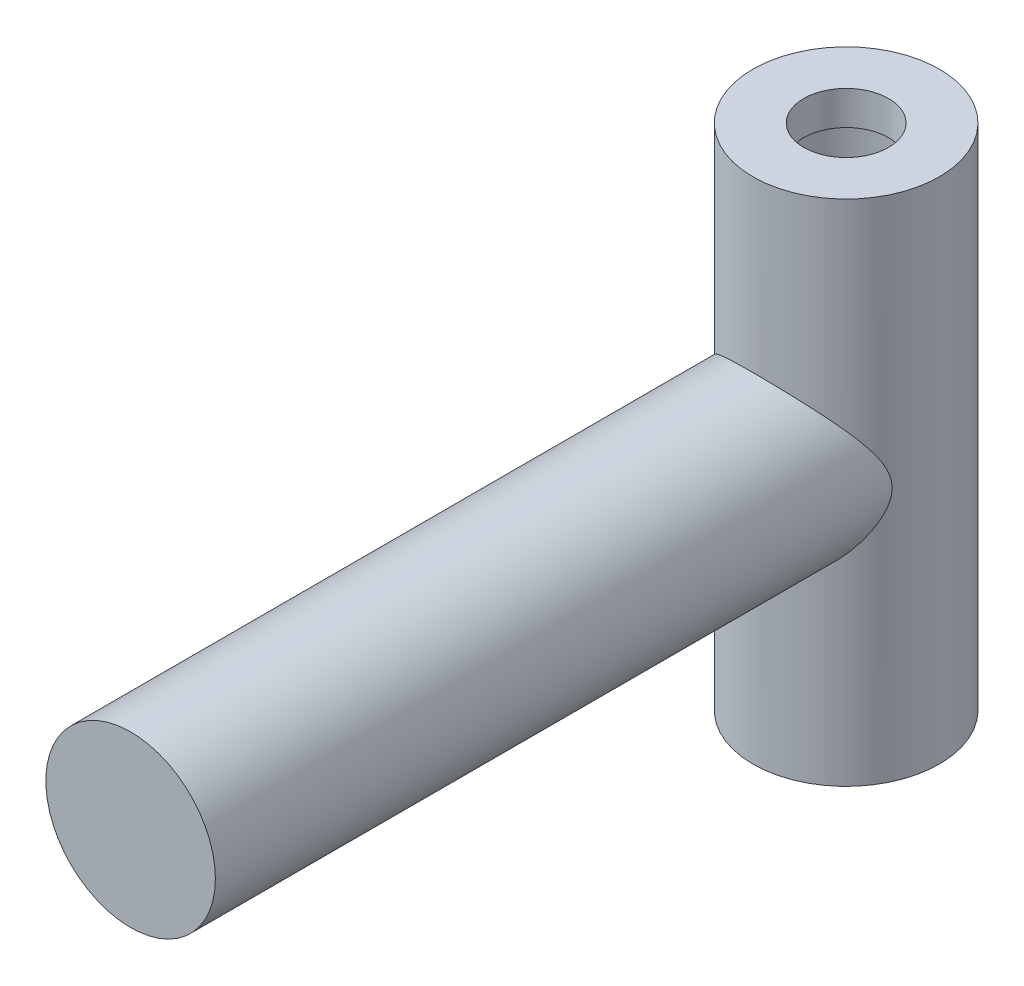
ISO-10303-21;
HEADER;
FILE_DESCRIPTION(('STEP AP214'),'2;1');
FILE_NAME('part.step','',(''),(''),'','','');
FILE_SCHEMA(('AUTOMOTIVE_DESIGN { 1 0 10303 214 1 1 1 1 }'));
ENDSEC;
DATA;
#1=APPLICATION_CONTEXT('core data for automotive mechanical design processes');
#2=APPLICATION_PROTOCOL_DEFINITION('international standard','automotive_design',2000,#1);
#3=PRODUCT_CONTEXT('',#1,'mechanical');
#4=PRODUCT('Part','Part','',(#3));
#5=PRODUCT_RELATED_PRODUCT_CATEGORY('part','',(#4));
#6=PRODUCT_DEFINITION_FORMATION('','',#4);
#7=PRODUCT_DEFINITION_CONTEXT('part definition',#1,'design');
#8=PRODUCT_DEFINITION('design','',#6,#7);
#9=PRODUCT_DEFINITION_SHAPE('','',#8);
#10=(LENGTH_UNIT() NAMED_UNIT(*) SI_UNIT(.MILLI.,.METRE.));
#11=(NAMED_UNIT(*) PLANE_ANGLE_UNIT() SI_UNIT($,.RADIAN.));
#12=(NAMED_UNIT(*) SI_UNIT($,.STERADIAN.) SOLID_ANGLE_UNIT());
#13=UNCERTAINTY_MEASURE_WITH_UNIT(LENGTH_MEASURE(1.E-05),#10,'distance_accuracy_value','');
#14=(GEOMETRIC_REPRESENTATION_CONTEXT(3) GLOBAL_UNCERTAINTY_ASSIGNED_CONTEXT((#13)) GLOBAL_UNIT_ASSIGNED_CONTEXT((#10,
#11,#12)) REPRESENTATION_CONTEXT('',''));
#15=CARTESIAN_POINT('',(0.,0.,0.));
#16=DIRECTION('',(0.,0.,1.));
#17=DIRECTION('',(1.,0.,0.));
#18=AXIS2_PLACEMENT_3D('',#15,#16,#17);
#19=CARTESIAN_POINT('',(0.,15.,-42.2021074721215));
#20=DIRECTION('',(0.,-1.,0.));
#21=DIRECTION('',(0.,0.,-1.));
#22=AXIS2_PLACEMENT_3D('',#19,#20,#21);
#23=CYLINDRICAL_SURFACE('',#22,3.75);
#24=CARTESIAN_POINT('',(0.,13.,-42.2021074721215));
#25=DIRECTION('',(0.,1.,0.));
#26=DIRECTION('',(0.,0.,1.));
#27=AXIS2_PLACEMENT_3D('',#24,#25,#26);
#28=CIRCLE('',#27,3.75);
#29=CARTESIAN_POINT('',(0.,13.,-38.4521074721215));
#30=VERTEX_POINT('',#29);
#31=EDGE_CURVE('E55',#30,#30,#28,.T.);
#32=ORIENTED_EDGE('',*,*,#31,.T.);
#33=EDGE_LOOP('',(#32));
#34=FACE_BOUND('',#33,.T.);
#35=CARTESIAN_POINT('',(0.,-13.,-42.2021074721215));
#36=DIRECTION('',(0.,-1.,0.));
#37=DIRECTION('',(0.,0.,-1.));
#38=AXIS2_PLACEMENT_3D('',#35,#36,#37);
#39=CIRCLE('',#38,3.75);
#40=CARTESIAN_POINT('',(0.,-13.,-45.9521074721215));
#41=VERTEX_POINT('',#40);
#42=EDGE_CURVE('E64',#41,#41,#39,.T.);
#43=ORIENTED_EDGE('',*,*,#42,.T.);
#44=EDGE_LOOP('',(#43));
#45=FACE_BOUND('',#44,.T.);
#46=ADVANCED_FACE('F34',(#34,#45),#23,.F.);
#47=CARTESIAN_POINT('',(0.,0.,-40.));
#48=DIRECTION('',(0.,0.,1.));
#49=DIRECTION('',(1.,0.,0.));
#50=AXIS2_PLACEMENT_3D('',#47,#48,#49);
#51=CYLINDRICAL_SURFACE('',#50,5.);
#52=CARTESIAN_POINT('',(0.,0.,0.));
#53=DIRECTION('',(0.,0.,1.));
#54=DIRECTION('',(1.,0.,0.));
#55=AXIS2_PLACEMENT_3D('',#52,#53,#54);
#56=CIRCLE('',#55,5.);
#57=CARTESIAN_POINT('',(5.,0.,0.));
#58=VERTEX_POINT('',#57);
#59=EDGE_CURVE('E10',#58,#58,#56,.T.);
#60=ORIENTED_EDGE('',*,*,#59,.F.);
#61=EDGE_LOOP('',(#60));
#62=FACE_BOUND('',#61,.T.);
#63=CARTESIAN_POINT('',(5.,0.,-39.9108196246436));
#64=CARTESIAN_POINT('',(5.00000113297913,0.072818406696161,-39.9108238042407));
#65=CARTESIAN_POINT('',(4.99840375594582,0.14562354498937,-39.9073267272771));
#66=CARTESIAN_POINT('',(4.99208280394166,0.290470829433464,-39.8936091320131));
#67=CARTESIAN_POINT('',(4.98735794936436,0.362512651010314,-39.8833858617031));
#68=CARTESIAN_POINT('',(4.96867487783918,0.576923955654385,-39.8434752082821));
#69=CARTESIAN_POINT('',(4.95020928835951,0.717227024558331,-39.8045518840473));
#70=CARTESIAN_POINT('',(4.90897975531947,0.955358030668248,-39.72148866949));
#71=CARTESIAN_POINT('',(4.88845767706937,1.05500875905859,-39.6811096665607));
#72=CARTESIAN_POINT('',(4.84224977251481,1.25005794420106,-39.5934529932407));
#73=CARTESIAN_POINT('',(4.81656035190679,1.34545338431232,-39.5461705272452));
#74=CARTESIAN_POINT('',(4.76035211424555,1.53252294867456,-39.4466908301892));
#75=CARTESIAN_POINT('',(4.729818554629,1.62418460318574,-39.3944787996224));
#76=CARTESIAN_POINT('',(4.66422536609522,1.80392549065167,-39.2868051789427));
#77=CARTESIAN_POINT('',(4.629164235468,1.89200352218195,-39.231342514004));
#78=CARTESIAN_POINT('',(4.52622188991097,2.13094431804233,-39.0752060983329));
#79=CARTESIAN_POINT('',(4.45371971657767,2.27840346598305,-38.9723425867294));
#80=CARTESIAN_POINT('',(4.29535848422937,2.56449139249705,-38.7645167559459));
#81=CARTESIAN_POINT('',(4.20949056129701,2.70311422437226,-38.6595530845282));
#82=CARTESIAN_POINT('',(4.02440857592174,2.97164612923788,-38.450629707795));
#83=CARTESIAN_POINT('',(3.92521086446259,3.10156559016108,-38.3466689371321));
#84=CARTESIAN_POINT('',(3.71321508636662,3.35246020804892,-38.1420896730786));
#85=CARTESIAN_POINT('',(3.60042409405383,3.47343996505305,-38.0414694756408));
#86=CARTESIAN_POINT('',(3.30039013103289,3.76436747390159,-37.7962507630662));
#87=CARTESIAN_POINT('',(3.10428135359111,3.92825077692637,-37.6550569618666));
#88=CARTESIAN_POINT('',(2.68039961987618,4.22879933828387,-37.3930120689691));
#89=CARTESIAN_POINT('',(2.45268253642058,4.36551161092509,-37.2721258958851));
#90=CARTESIAN_POINT('',(2.01559638434472,4.58085306810153,-37.080356960024));
#91=CARTESIAN_POINT('',(1.8115895009836,4.66562662123139,-37.0043108470753));
#92=CARTESIAN_POINT('',(1.49372669549173,4.77297988015737,-36.9076670187978));
#93=CARTESIAN_POINT('',(1.3857653581897,4.80546939575129,-36.8783509091358));
#94=CARTESIAN_POINT('',(1.16647849336554,4.86334911218986,-36.8260485534815));
#95=CARTESIAN_POINT('',(1.0551544460886,4.88874238771381,-36.803059566121));
#96=CARTESIAN_POINT('',(0.829123380153149,4.93212812805186,-36.7637434321286));
#97=CARTESIAN_POINT('',(0.71439882446472,4.950070403642,-36.7474614691027));
#98=CARTESIAN_POINT('',(0.483182989197356,4.97796050885968,-36.7221388134528));
#99=CARTESIAN_POINT('',(0.366691705054748,4.98790831783295,-36.7130981395371));
#100=CARTESIAN_POINT('',(0.13299229597601,4.99959967483202,-36.7024719426464));
#101=CARTESIAN_POINT('',(0.0157843953068352,5.00134567000864,-36.7008841959637));
#102=CARTESIAN_POINT('',(-0.21831892570983,4.99660310781875,-36.705195462511));
#103=CARTESIAN_POINT('',(-0.33521436863845,4.99011516257369,-36.7110939192073));
#104=CARTESIAN_POINT('',(-0.555781182945719,4.97011922421285,-36.729259076945));
#105=CARTESIAN_POINT('',(-0.659583720795754,4.9573959598163,-36.7408137757558));
#106=CARTESIAN_POINT('',(-0.865428162302108,4.92563691315658,-36.7696259381508));
#107=CARTESIAN_POINT('',(-0.967469476325625,4.90659905838743,-36.7868852740422));
#108=CARTESIAN_POINT('',(-1.26993217546432,4.84042946556479,-36.8467926538243));
#109=CARTESIAN_POINT('',(-1.46686590619095,4.7842253319185,-36.8975850405282));
#110=CARTESIAN_POINT('',(-1.85664936649551,4.64733647392074,-37.0207176289504));
#111=CARTESIAN_POINT('',(-2.04880795640487,4.56557252042397,-37.0940044943169));
#112=CARTESIAN_POINT('',(-2.41595357951577,4.38238280202246,-37.2570564954043));
#113=CARTESIAN_POINT('',(-2.59093408133276,4.28094960183169,-37.3468278618443));
#114=CARTESIAN_POINT('',(-2.88340978120873,4.08766713986788,-37.5162347364722));
#115=CARTESIAN_POINT('',(-3.00472310094416,3.99920960232695,-37.5932589410128));
#116=CARTESIAN_POINT('',(-3.23667919599462,3.81391380429555,-37.7530921620228));
#117=CARTESIAN_POINT('',(-3.34732079028613,3.71707461846582,-37.8359018170145));
#118=CARTESIAN_POINT('',(-3.55834849344643,3.51561036301624,-38.0060860818136));
#119=CARTESIAN_POINT('',(-3.6586987165162,3.41096011050271,-38.0934751599173));
#120=CARTESIAN_POINT('',(-3.84888445496252,3.19480971019255,-38.2710759276681));
#121=CARTESIAN_POINT('',(-3.93872212795153,3.08331097517815,-38.361287033284));
#122=CARTESIAN_POINT('',(-4.11016950059676,2.85094181036064,-38.5452380985073));
#123=CARTESIAN_POINT('',(-4.19152368143234,2.7299086985483,-38.6390103652278));
#124=CARTESIAN_POINT('',(-4.34359091301377,2.48083202362346,-38.8260534166856));
#125=CARTESIAN_POINT('',(-4.41429824252251,2.35278474138935,-38.9193239060125));
#126=CARTESIAN_POINT('',(-4.54478204662434,2.08961106442453,-39.102502725649));
#127=CARTESIAN_POINT('',(-4.60459196737135,1.95450802565613,-39.1924206459607));
#128=CARTESIAN_POINT('',(-4.71314642768848,1.67588468084313,-39.365449173808));
#129=CARTESIAN_POINT('',(-4.76190491191656,1.53237527307656,-39.4485682744233));
#130=CARTESIAN_POINT('',(-4.84094684730184,1.25792908194543,-39.590442625179));
#131=CARTESIAN_POINT('',(-4.87291480410755,1.12842118783503,-39.6509800416774));
#132=CARTESIAN_POINT('',(-4.92708346087398,0.861562319619029,-39.7572331036629));
#133=CARTESIAN_POINT('',(-4.94930703644749,0.724230579070068,-39.8029833957974));
#134=CARTESIAN_POINT('',(-4.97974741004082,0.465056711666964,-39.866899316647));
#135=CARTESIAN_POINT('',(-4.98963443027738,0.344243956439049,-39.8883036442298));
#136=CARTESIAN_POINT('',(-5.00047546334365,0.100395726163395,-39.911814837039));
#137=CARTESIAN_POINT('',(-5.00144119497305,-0.022636620234906,-39.9139470176354));
#138=CARTESIAN_POINT('',(-4.99436523096602,-0.266938660949806,-39.8985521302397));
#139=CARTESIAN_POINT('',(-4.98633661286028,-0.388210655369742,-39.8810536046888));
#140=CARTESIAN_POINT('',(-4.96205550576029,-0.626429426414565,-39.8296025500604));
#141=CARTESIAN_POINT('',(-4.94578639869108,-0.74336694855905,-39.7956167780632));
#142=CARTESIAN_POINT('',(-4.90843166184471,-0.957977500216544,-39.7204066377833));
#143=CARTESIAN_POINT('',(-4.88815245611557,-1.05628421036888,-39.6805300002216));
#144=CARTESIAN_POINT('',(-4.84256662655346,-1.24873339141958,-39.5940547280232));
#145=CARTESIAN_POINT('',(-4.81725580909172,-1.34287230807718,-39.5474504951621));
#146=CARTESIAN_POINT('',(-4.76191154075442,-1.52758985423841,-39.4494034542825));
#147=CARTESIAN_POINT('',(-4.73186109667268,-1.61815414761915,-39.3979435143688));
#148=CARTESIAN_POINT('',(-4.66734375896675,-1.79578025167436,-39.2918206161973));
#149=CARTESIAN_POINT('',(-4.63287532871504,-1.8828408298059,-39.2371565471128));
#150=CARTESIAN_POINT('',(-4.53095371198956,-2.12085681255015,-39.0820826982875));
#151=CARTESIAN_POINT('',(-4.45883433431432,-2.26836715132037,-38.9794223574061));
#152=CARTESIAN_POINT('',(-4.30126595762759,-2.55456171499491,-38.7719253132166));
#153=CARTESIAN_POINT('',(-4.21580780821694,-2.69323978832107,-38.6670871590488));
#154=CARTESIAN_POINT('',(-4.03157468458783,-2.96190672494949,-38.4583447790868));
#155=CARTESIAN_POINT('',(-3.93281540990373,-3.09190556594561,-38.3544396040143));
#156=CARTESIAN_POINT('',(-3.72173221735279,-3.34299152977476,-38.1499082145015));
#157=CARTESIAN_POINT('',(-3.6094153857539,-3.46408325536968,-38.0492803217174));
#158=CARTESIAN_POINT('',(-3.30996990546729,-3.75598126525108,-37.8034272645517));
#159=CARTESIAN_POINT('',(-3.11388410011037,-3.92067710626405,-37.6616063554278));
#160=CARTESIAN_POINT('',(-2.68988447946418,-4.2228031595701,-37.3982910321278));
#161=CARTESIAN_POINT('',(-2.46202790948156,-4.36028135839243,-37.2767609043144));
#162=CARTESIAN_POINT('',(-2.02478489271366,-4.5768050419023,-37.083979183789));
#163=CARTESIAN_POINT('',(-1.82082310285447,-4.66203815016835,-37.0075329883091));
#164=CARTESIAN_POINT('',(-1.50295435112073,-4.77008401253803,-36.9102778393035));
#165=CARTESIAN_POINT('',(-1.39497826532641,-4.80280510344757,-36.8807559421632));
#166=CARTESIAN_POINT('',(-1.17563545045081,-4.86114570052186,-36.8280419862325));
#167=CARTESIAN_POINT('',(-1.06427021493337,-4.88676828603511,-36.8048471828012));
#168=CARTESIAN_POINT('',(-0.838122466514915,-4.93060930215913,-36.7651210082621));
#169=CARTESIAN_POINT('',(-0.723322091376913,-4.94877711277645,-36.7486351991011));
#170=CARTESIAN_POINT('',(-0.491925744862897,-4.9771068627956,-36.7229143475126));
#171=CARTESIAN_POINT('',(-0.375329768859734,-4.98726878156326,-36.7136793237733));
#172=CARTESIAN_POINT('',(-0.141394992808617,-4.99937207136784,-36.7026788901299));
#173=CARTESIAN_POINT('',(-0.0240564333016959,-5.00131598033077,-36.7009111741355));
#174=CARTESIAN_POINT('',(0.210331977372222,-4.99694894023192,-36.7048810912978));
#175=CARTESIAN_POINT('',(0.327381849666793,-4.99063861436894,-36.7106181578398));
#176=CARTESIAN_POINT('',(0.548168502475217,-4.97096548575154,-36.7284904929286));
#177=CARTESIAN_POINT('',(0.652035551583851,-4.95839541342523,-36.739906445649));
#178=CARTESIAN_POINT('',(0.85802397282583,-4.92693312156243,-36.7684505587403));
#179=CARTESIAN_POINT('',(0.960144760479275,-4.90803882719582,-36.7855805937624));
#180=CARTESIAN_POINT('',(1.26286371398338,-4.84228295503823,-36.845116887235));
#181=CARTESIAN_POINT('',(1.4599931798918,-4.78633219035761,-36.8956841511603));
#182=CARTESIAN_POINT('',(1.84999593204291,-4.64998486100391,-37.018341198075));
#183=CARTESIAN_POINT('',(2.04219490756072,-4.56853088487785,-37.0913588473878));
#184=CARTESIAN_POINT('',(2.40947050963107,-4.38594704742492,-37.253896159556));
#185=CARTESIAN_POINT('',(2.58454032764489,-4.28480940954962,-37.3434223438056));
#186=CARTESIAN_POINT('',(2.87712779699073,-4.09208588808886,-37.5123782183874));
#187=CARTESIAN_POINT('',(2.99846305802958,-4.00390003583728,-37.5891865044873));
#188=CARTESIAN_POINT('',(3.23049117038405,-3.81915110931395,-37.7485997482363));
#189=CARTESIAN_POINT('',(3.34118284805349,-3.72258711342962,-37.8312053434096));
#190=CARTESIAN_POINT('',(3.55232216925481,-3.52169261974881,-38.0009859895285));
#191=CARTESIAN_POINT('',(3.65273543623651,-3.41733795661877,-38.0881749871394));
#192=CARTESIAN_POINT('',(3.84307436377126,-3.20178852976633,-38.2653980294892));
#193=CARTESIAN_POINT('',(3.93300213786099,-3.09059515143412,-38.3554314962087));
#194=CARTESIAN_POINT('',(4.10463562211664,-2.85889150764771,-38.5390305893034));
#195=CARTESIAN_POINT('',(4.18608933430531,-2.73822078066686,-38.6326289431254));
#196=CARTESIAN_POINT('',(4.33838939630401,-2.48990148110185,-38.8193732334828));
#197=CARTESIAN_POINT('',(4.40923022627243,-2.36224932421135,-38.9125189103779));
#198=CARTESIAN_POINT('',(4.54006094552793,-2.09983399851005,-39.0955888055953));
#199=CARTESIAN_POINT('',(4.60007788831174,-1.96508967761999,-39.1855205921595));
#200=CARTESIAN_POINT('',(4.70908640356133,-1.68723289957812,-39.3587062737083));
#201=CARTESIAN_POINT('',(4.75809136239438,-1.54413087188853,-39.4419681965559));
#202=CARTESIAN_POINT('',(4.83996623942231,-1.26256104454728,-39.588480087016));
#203=CARTESIAN_POINT('',(4.87395414975951,-1.125040398486,-39.6528956916774));
#204=CARTESIAN_POINT('',(4.93083208839087,-0.84121696528183,-39.7647205545113));
#205=CARTESIAN_POINT('',(4.95376381708658,-0.694949553512623,-39.8121935359486));
#206=CARTESIAN_POINT('',(4.97996795954922,-0.456012737503809,-39.8674887812484));
#207=CARTESIAN_POINT('',(4.98744264943972,-0.365728843994368,-39.8835845766529));
#208=CARTESIAN_POINT('',(4.99745661290195,-0.183622361370882,-39.9052444988336));
#209=CARTESIAN_POINT('',(4.99999857167699,-0.0918006368723005,-39.9108143555133));
#210=CARTESIAN_POINT('',(5.,0.,-39.9108196246436));
#211=B_SPLINE_CURVE_WITH_KNOTS('',3,(#63,#64,#65,#66,#67,#68,#69,#70,#71,#72,#73,#74,#75,#76,
#77,#78,#79,#80,#81,#82,#83,#84,#85,#86,#87,#88,#89,#90,#91,#92,#93,#94,#95,#96,#97,#98,#99,
#100,#101,#102,#103,#104,#105,#106,#107,#108,#109,#110,#111,#112,#113,#114,#115,#116,#117,#118,
#119,#120,#121,#122,#123,#124,#125,#126,#127,#128,#129,#130,#131,#132,#133,#134,#135,#136,#137,
#138,#139,#140,#141,#142,#143,#144,#145,#146,#147,#148,#149,#150,#151,#152,#153,#154,#155,#156,
#157,#158,#159,#160,#161,#162,#163,#164,#165,#166,#167,#168,#169,#170,#171,#172,#173,#174,#175,
#176,#177,#178,#179,#180,#181,#182,#183,#184,#185,#186,#187,#188,#189,#190,#191,#192,#193,#194,
#195,#196,#197,#198,#199,#200,#201,#202,#203,#204,#205,#206,#207,#208,#209,#210),.UNSPECIFIED.,
.T.,.F.,(4,2,2,2,2,2,2,2,2,2,2,2,2,2,2,2,2,2,2,2,2,2,2,2,2,2,2,2,2,2,2,2,2,2,2,2,2,2,2,2,2,2,2,
2,2,2,2,2,2,2,2,2,2,2,2,2,2,2,2,2,2,2,2,2,2,2,2,2,2,2,2,2,2,4),(0.,0.218329707003951,
0.436748798801062,0.874625317292106,1.20260684086132,1.5308172959092,1.86004649017721,
2.1893851654,2.77015662584752,3.3513148971805,3.93176668975361,4.51191769295831,
5.38457227984649,6.25570349991799,6.95353245168341,7.30264104191108,7.65159813400494,
8.00286906594579,8.3541409054167,8.70530793029307,9.05644885050227,9.37172360495146,
9.68710193800186,10.3173398547445,10.978946406446,11.6408035451439,12.1463913779626,
12.6520350993682,13.1593859776734,13.6666325431615,14.1863069872965,14.7062596968875,
15.2245886580266,15.7422599069789,16.1808417200141,16.6183883460944,16.9860504209118,
17.3532294744938,17.719875352188,18.0872635829898,18.4108112908721,18.734629800852,
19.0596368711135,19.3847572909684,19.9648898343065,20.5454221120604,21.1252750869209,
21.7048262858423,22.5797042772008,23.45302578808,24.1516299056148,24.5011292890598,
24.8504768205888,25.2021587556575,25.5538415971397,25.9054158222685,26.2569635049018,
26.5723279126336,26.8877958856678,27.5182098834148,28.179311731396,28.8406752972036,
29.3455889768084,29.8505582685183,30.3571647609409,30.8636689606799,31.3824450087132,
31.9014899463475,32.4192190258498,32.9363152982583,33.402144938758,33.8662035999874,
34.1415972354913,34.4168409143971),.UNSPECIFIED.);
#212=CARTESIAN_POINT('',(5.,0.,-39.9108196246436));
#213=VERTEX_POINT('',#212);
#214=EDGE_CURVE('E39',#213,#213,#211,.T.);
#215=ORIENTED_EDGE('',*,*,#214,.T.);
#216=EDGE_LOOP('',(#215));
#217=FACE_BOUND('',#216,.T.);
#218=ADVANCED_FACE('F36',(#62,#217),#51,.T.);
#219=CARTESIAN_POINT('',(0.,0.,0.));
#220=DIRECTION('',(0.,0.,1.));
#221=DIRECTION('',(1.,0.,0.));
#222=AXIS2_PLACEMENT_3D('',#219,#220,#221);
#223=PLANE('',#222);
#224=ORIENTED_EDGE('',*,*,#59,.T.);
#225=EDGE_LOOP('',(#224));
#226=FACE_BOUND('',#225,.T.);
#227=ADVANCED_FACE('F99',(#226),#223,.T.);
#228=CARTESIAN_POINT('',(0.,15.,-42.2021074721215));
#229=DIRECTION('',(0.,1.,0.));
#230=DIRECTION('',(0.,0.,1.));
#231=AXIS2_PLACEMENT_3D('',#228,#229,#230);
#232=PLANE('',#231);
#233=CARTESIAN_POINT('',(0.,15.,-42.2021074721215));
#234=DIRECTION('',(0.,1.,0.));
#235=DIRECTION('',(0.,0.,1.));
#236=AXIS2_PLACEMENT_3D('',#233,#234,#235);
#237=CIRCLE('',#236,5.5);
#238=CARTESIAN_POINT('',(0.,15.,-36.7021074721215));
#239=VERTEX_POINT('',#238);
#240=EDGE_CURVE('E50',#239,#239,#237,.T.);
#241=ORIENTED_EDGE('',*,*,#240,.T.);
#242=EDGE_LOOP('',(#241));
#243=FACE_BOUND('',#242,.T.);
#244=CARTESIAN_POINT('',(0.,15.,-42.2021074721215));
#245=DIRECTION('',(0.,1.,0.));
#246=DIRECTION('',(0.,0.,1.));
#247=AXIS2_PLACEMENT_3D('',#244,#245,#246);
#248=CIRCLE('',#247,2.5);
#249=CARTESIAN_POINT('',(0.,15.,-39.7021074721215));
#250=VERTEX_POINT('',#249);
#251=EDGE_CURVE('E61',#250,#250,#248,.T.);
#252=ORIENTED_EDGE('',*,*,#251,.F.);
#253=EDGE_LOOP('',(#252));
#254=FACE_BOUND('',#253,.T.);
#255=ADVANCED_FACE('F104',(#243,#254),#232,.T.);
#256=CARTESIAN_POINT('',(0.,-15.,-42.2021074721215));
#257=DIRECTION('',(0.,1.,0.));
#258=DIRECTION('',(0.,0.,1.));
#259=AXIS2_PLACEMENT_3D('',#256,#257,#258);
#260=PLANE('',#259);
#261=CARTESIAN_POINT('',(0.,-15.,-42.2021074721215));
#262=DIRECTION('',(0.,1.,0.));
#263=DIRECTION('',(0.,0.,1.));
#264=AXIS2_PLACEMENT_3D('',#261,#262,#263);
#265=CIRCLE('',#264,5.5);
#266=CARTESIAN_POINT('',(0.,-15.,-36.7021074721215));
#267=VERTEX_POINT('',#266);
#268=EDGE_CURVE('E52',#267,#267,#265,.T.);
#269=ORIENTED_EDGE('',*,*,#268,.F.);
#270=EDGE_LOOP('',(#269));
#271=FACE_BOUND('',#270,.T.);
#272=CARTESIAN_POINT('',(0.,-15.,-42.2021074721215));
#273=DIRECTION('',(0.,1.,0.));
#274=DIRECTION('',(0.,0.,1.));
#275=AXIS2_PLACEMENT_3D('',#272,#273,#274);
#276=CIRCLE('',#275,2.5);
#277=CARTESIAN_POINT('',(0.,-15.,-39.7021074721215));
#278=VERTEX_POINT('',#277);
#279=EDGE_CURVE('E70',#278,#278,#276,.T.);
#280=ORIENTED_EDGE('',*,*,#279,.T.);
#281=EDGE_LOOP('',(#280));
#282=FACE_BOUND('',#281,.T.);
#283=ADVANCED_FACE('F107',(#271,#282),#260,.F.);
#284=CARTESIAN_POINT('',(0.,15.,-42.2021074721215));
#285=DIRECTION('',(0.,-1.,0.));
#286=DIRECTION('',(0.,0.,-1.));
#287=AXIS2_PLACEMENT_3D('',#284,#285,#286);
#288=CYLINDRICAL_SURFACE('',#287,5.5);
#289=ORIENTED_EDGE('',*,*,#268,.T.);
#290=EDGE_LOOP('',(#289));
#291=FACE_BOUND('',#290,.T.);
#292=ORIENTED_EDGE('',*,*,#214,.F.);
#293=EDGE_LOOP('',(#292));
#294=FACE_BOUND('',#293,.T.);
#295=ORIENTED_EDGE('',*,*,#240,.F.);
#296=EDGE_LOOP('',(#295));
#297=FACE_BOUND('',#296,.T.);
#298=ADVANCED_FACE('F110',(#291,#294,#297),#288,.T.);
#299=CARTESIAN_POINT('',(0.,13.,-42.2021074721215));
#300=DIRECTION('',(0.,1.,0.));
#301=DIRECTION('',(0.,0.,1.));
#302=AXIS2_PLACEMENT_3D('',#299,#300,#301);
#303=PLANE('',#302);
#304=ORIENTED_EDGE('',*,*,#31,.F.);
#305=EDGE_LOOP('',(#304));
#306=FACE_BOUND('',#305,.T.);
#307=CARTESIAN_POINT('',(0.,13.,-42.2021074721215));
#308=DIRECTION('',(0.,1.,0.));
#309=DIRECTION('',(0.,0.,1.));
#310=AXIS2_PLACEMENT_3D('',#307,#308,#309);
#311=CIRCLE('',#310,2.5);
#312=CARTESIAN_POINT('',(0.,13.,-39.7021074721215));
#313=VERTEX_POINT('',#312);
#314=EDGE_CURVE('E60',#313,#313,#311,.T.);
#315=ORIENTED_EDGE('',*,*,#314,.T.);
#316=EDGE_LOOP('',(#315));
#317=FACE_BOUND('',#316,.T.);
#318=ADVANCED_FACE('F89',(#306,#317),#303,.F.);
#319=CARTESIAN_POINT('',(0.,13.,-42.2021074721215));
#320=DIRECTION('',(0.,1.,0.));
#321=DIRECTION('',(0.,0.,1.));
#322=AXIS2_PLACEMENT_3D('',#319,#320,#321);
#323=CYLINDRICAL_SURFACE('',#322,2.5);
#324=ORIENTED_EDGE('',*,*,#314,.F.);
#325=EDGE_LOOP('',(#324));
#326=FACE_BOUND('',#325,.T.);
#327=ORIENTED_EDGE('',*,*,#251,.T.);
#328=EDGE_LOOP('',(#327));
#329=FACE_BOUND('',#328,.T.);
#330=ADVANCED_FACE('F81',(#326,#329),#323,.F.);
#331=CARTESIAN_POINT('',(0.,-13.,-42.2021074721215));
#332=DIRECTION('',(0.,-1.,0.));
#333=DIRECTION('',(0.,0.,1.));
#334=AXIS2_PLACEMENT_3D('',#331,#332,#333);
#335=PLANE('',#334);
#336=ORIENTED_EDGE('',*,*,#42,.F.);
#337=EDGE_LOOP('',(#336));
#338=FACE_BOUND('',#337,.T.);
#339=CARTESIAN_POINT('',(0.,-13.,-42.2021074721215));
#340=DIRECTION('',(0.,1.,0.));
#341=DIRECTION('',(0.,0.,1.));
#342=AXIS2_PLACEMENT_3D('',#339,#340,#341);
#343=CIRCLE('',#342,2.5);
#344=CARTESIAN_POINT('',(0.,-13.,-39.7021074721215));
#345=VERTEX_POINT('',#344);
#346=EDGE_CURVE('E69',#345,#345,#343,.T.);
#347=ORIENTED_EDGE('',*,*,#346,.F.);
#348=EDGE_LOOP('',(#347));
#349=FACE_BOUND('',#348,.T.);
#350=ADVANCED_FACE('F79',(#338,#349),#335,.F.);
#351=CARTESIAN_POINT('',(0.,-13.,-42.2021074721215));
#352=DIRECTION('',(0.,-1.,0.));
#353=DIRECTION('',(0.,0.,-1.));
#354=AXIS2_PLACEMENT_3D('',#351,#352,#353);
#355=CYLINDRICAL_SURFACE('',#354,2.5);
#356=ORIENTED_EDGE('',*,*,#346,.T.);
#357=EDGE_LOOP('',(#356));
#358=FACE_BOUND('',#357,.T.);
#359=ORIENTED_EDGE('',*,*,#279,.F.);
#360=EDGE_LOOP('',(#359));
#361=FACE_BOUND('',#360,.T.);
#362=ADVANCED_FACE('F76',(#358,#361),#355,.F.);
#363=CLOSED_SHELL('',(#46,#218,#227,#255,#283,#298,#318,#330,#350,#362));
#364=MANIFOLD_SOLID_BREP('B2',#363);
#365=ADVANCED_BREP_SHAPE_REPRESENTATION('',(#18,#364),#14);
#366=SHAPE_DEFINITION_REPRESENTATION(#9,#365);
ENDSEC;
END-ISO-10303-21;
